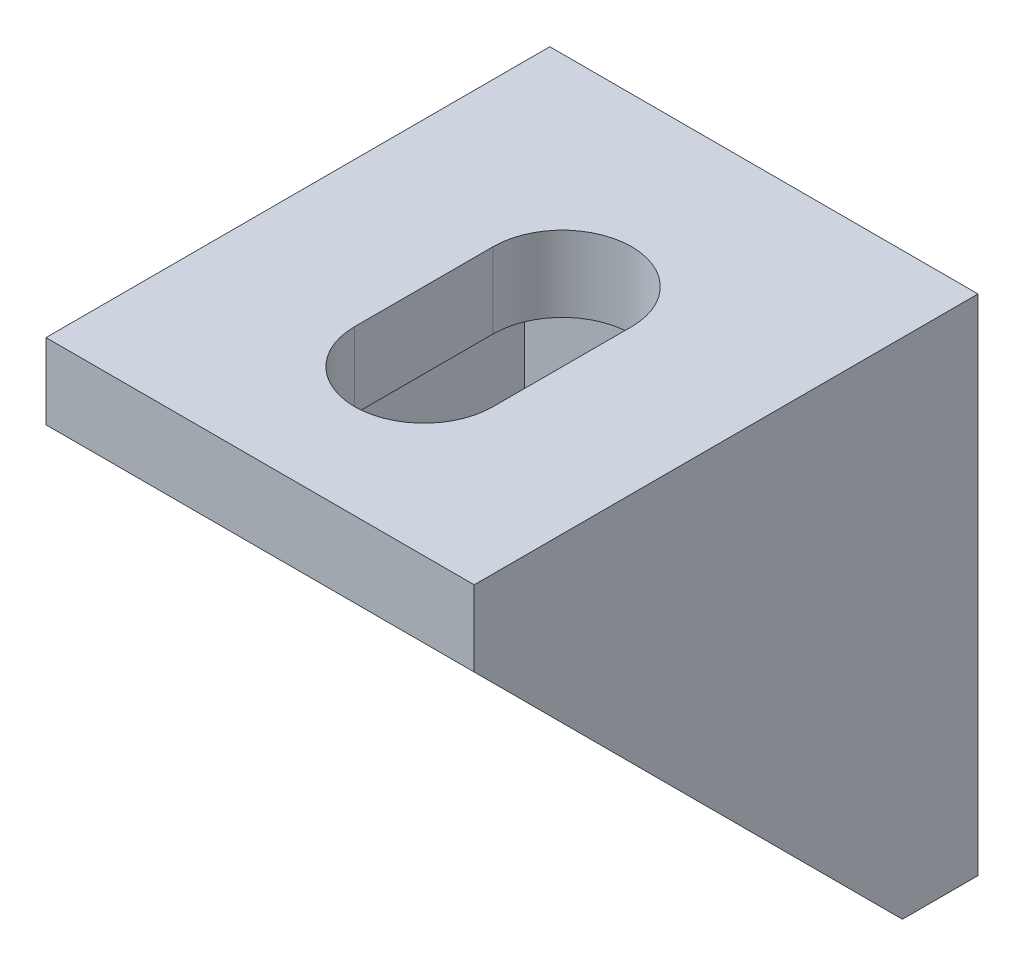
ISO-10303-21;
HEADER;
FILE_DESCRIPTION(('STEP AP214'),'2;1');
FILE_NAME('part.step','',(''),(''),'','','');
FILE_SCHEMA(('AUTOMOTIVE_DESIGN { 1 0 10303 214 1 1 1 1 }'));
ENDSEC;
DATA;
#1=APPLICATION_CONTEXT('core data for automotive mechanical design processes');
#2=APPLICATION_PROTOCOL_DEFINITION('international standard','automotive_design',2000,#1);
#3=PRODUCT_CONTEXT('',#1,'mechanical');
#4=PRODUCT('Part','Part','',(#3));
#5=PRODUCT_RELATED_PRODUCT_CATEGORY('part','',(#4));
#6=PRODUCT_DEFINITION_FORMATION('','',#4);
#7=PRODUCT_DEFINITION_CONTEXT('part definition',#1,'design');
#8=PRODUCT_DEFINITION('design','',#6,#7);
#9=PRODUCT_DEFINITION_SHAPE('','',#8);
#10=(LENGTH_UNIT() NAMED_UNIT(*) SI_UNIT(.MILLI.,.METRE.));
#11=(NAMED_UNIT(*) PLANE_ANGLE_UNIT() SI_UNIT($,.RADIAN.));
#12=(NAMED_UNIT(*) SI_UNIT($,.STERADIAN.) SOLID_ANGLE_UNIT());
#13=UNCERTAINTY_MEASURE_WITH_UNIT(LENGTH_MEASURE(1.E-05),#10,'distance_accuracy_value','');
#14=(GEOMETRIC_REPRESENTATION_CONTEXT(3) GLOBAL_UNCERTAINTY_ASSIGNED_CONTEXT((#13)) GLOBAL_UNIT_ASSIGNED_CONTEXT((#10,
#11,#12)) REPRESENTATION_CONTEXT('',''));
#15=CARTESIAN_POINT('',(0.,0.,0.));
#16=DIRECTION('',(0.,0.,1.));
#17=DIRECTION('',(1.,0.,0.));
#18=AXIS2_PLACEMENT_3D('',#15,#16,#17);
#19=CARTESIAN_POINT('',(8.5,-11.5,3.));
#20=DIRECTION('',(0.,0.,-1.));
#21=DIRECTION('',(0.,1.,0.));
#22=AXIS2_PLACEMENT_3D('',#19,#20,#21);
#23=PLANE('',#22);
#24=DIRECTION('',(0.,-1.,0.));
#25=VECTOR('',#24,1.);
#26=CARTESIAN_POINT('',(6.5,-11.5,3.));
#27=LINE('',#26,#25);
#28=CARTESIAN_POINT('',(6.5,-3.,3.));
#29=VERTEX_POINT('',#28);
#30=CARTESIAN_POINT('',(6.5,-20.,3.));
#31=VERTEX_POINT('',#30);
#32=EDGE_CURVE('E11',#29,#31,#27,.T.);
#33=ORIENTED_EDGE('',*,*,#32,.F.);
#34=DIRECTION('',(-1.,0.,0.));
#35=VECTOR('',#34,1.);
#36=CARTESIAN_POINT('',(8.5,-3.,3.));
#37=LINE('',#36,#35);
#38=CARTESIAN_POINT('',(-6.5,-3.,3.));
#39=VERTEX_POINT('',#38);
#40=EDGE_CURVE('E24',#29,#39,#37,.T.);
#41=ORIENTED_EDGE('',*,*,#40,.T.);
#42=DIRECTION('',(0.,1.,0.));
#43=VECTOR('',#42,1.);
#44=CARTESIAN_POINT('',(-6.5,-11.5,3.));
#45=LINE('',#44,#43);
#46=CARTESIAN_POINT('',(-6.5,-20.,3.));
#47=VERTEX_POINT('',#46);
#48=EDGE_CURVE('E232',#47,#39,#45,.T.);
#49=ORIENTED_EDGE('',*,*,#48,.F.);
#50=DIRECTION('',(-1.,0.,0.));
#51=VECTOR('',#50,1.);
#52=CARTESIAN_POINT('',(8.5,-20.,3.));
#53=LINE('',#52,#51);
#54=EDGE_CURVE('E230',#31,#47,#53,.T.);
#55=ORIENTED_EDGE('',*,*,#54,.F.);
#56=EDGE_LOOP('',(#33,#41,#49,#55));
#57=FACE_BOUND('',#56,.T.);
#58=CARTESIAN_POINT('',(0.,-13.5,3.));
#59=DIRECTION('',(0.,0.,-1.));
#60=DIRECTION('',(0.,1.,0.));
#61=AXIS2_PLACEMENT_3D('',#58,#59,#60);
#62=CIRCLE('',#61,2.75);
#63=CARTESIAN_POINT('',(-2.75,-13.5,3.));
#64=VERTEX_POINT('',#63);
#65=CARTESIAN_POINT('',(2.75,-13.5,3.));
#66=VERTEX_POINT('',#65);
#67=EDGE_CURVE('E227',#64,#66,#62,.F.);
#68=ORIENTED_EDGE('',*,*,#67,.F.);
#69=DIRECTION('',(0.,1.,0.));
#70=VECTOR('',#69,1.);
#71=CARTESIAN_POINT('',(-2.75,-11.5,3.));
#72=LINE('',#71,#70);
#73=CARTESIAN_POINT('',(-2.75,-8.,3.));
#74=VERTEX_POINT('',#73);
#75=EDGE_CURVE('E225',#64,#74,#72,.T.);
#76=ORIENTED_EDGE('',*,*,#75,.T.);
#77=CARTESIAN_POINT('',(0.,-8.,3.));
#78=DIRECTION('',(0.,0.,-1.));
#79=DIRECTION('',(0.,1.,0.));
#80=AXIS2_PLACEMENT_3D('',#77,#78,#79);
#81=CIRCLE('',#80,2.75);
#82=CARTESIAN_POINT('',(2.75,-8.,3.));
#83=VERTEX_POINT('',#82);
#84=EDGE_CURVE('E222',#83,#74,#81,.F.);
#85=ORIENTED_EDGE('',*,*,#84,.F.);
#86=DIRECTION('',(0.,1.,0.));
#87=VECTOR('',#86,1.);
#88=CARTESIAN_POINT('',(2.75,-11.5,3.));
#89=LINE('',#88,#87);
#90=EDGE_CURVE('E219',#66,#83,#89,.T.);
#91=ORIENTED_EDGE('',*,*,#90,.F.);
#92=EDGE_LOOP('',(#68,#76,#85,#91));
#93=FACE_BOUND('',#92,.T.);
#94=ADVANCED_FACE('F17',(#57,#93),#23,.F.);
#95=CARTESIAN_POINT('',(8.5,-10.,0.));
#96=DIRECTION('',(0.,0.,1.));
#97=DIRECTION('',(0.,-1.,0.));
#98=AXIS2_PLACEMENT_3D('',#95,#96,#97);
#99=PLANE('',#98);
#100=DIRECTION('',(0.,1.,0.));
#101=VECTOR('',#100,1.);
#102=CARTESIAN_POINT('',(-8.5,-10.,0.));
#103=LINE('',#102,#101);
#104=CARTESIAN_POINT('',(-8.5,-20.,0.));
#105=VERTEX_POINT('',#104);
#106=CARTESIAN_POINT('',(-8.5,0.,0.));
#107=VERTEX_POINT('',#106);
#108=EDGE_CURVE('E217',#105,#107,#103,.T.);
#109=ORIENTED_EDGE('',*,*,#108,.T.);
#110=DIRECTION('',(-1.,0.,0.));
#111=VECTOR('',#110,1.);
#112=CARTESIAN_POINT('',(8.5,0.,0.));
#113=LINE('',#112,#111);
#114=CARTESIAN_POINT('',(8.5,0.,0.));
#115=VERTEX_POINT('',#114);
#116=EDGE_CURVE('E214',#115,#107,#113,.T.);
#117=ORIENTED_EDGE('',*,*,#116,.F.);
#118=DIRECTION('',(0.,1.,0.));
#119=VECTOR('',#118,1.);
#120=CARTESIAN_POINT('',(8.5,-10.,0.));
#121=LINE('',#120,#119);
#122=CARTESIAN_POINT('',(8.5,-20.,0.));
#123=VERTEX_POINT('',#122);
#124=EDGE_CURVE('E212',#123,#115,#121,.T.);
#125=ORIENTED_EDGE('',*,*,#124,.F.);
#126=DIRECTION('',(-1.,0.,0.));
#127=VECTOR('',#126,1.);
#128=CARTESIAN_POINT('',(8.5,-20.,0.));
#129=LINE('',#128,#127);
#130=EDGE_CURVE('E210',#123,#105,#129,.T.);
#131=ORIENTED_EDGE('',*,*,#130,.T.);
#132=EDGE_LOOP('',(#109,#117,#125,#131));
#133=FACE_BOUND('',#132,.T.);
#134=CARTESIAN_POINT('',(0.,-13.5,0.));
#135=DIRECTION('',(0.,0.,1.));
#136=DIRECTION('',(1.,0.,0.));
#137=AXIS2_PLACEMENT_3D('',#134,#135,#136);
#138=CIRCLE('',#137,2.75);
#139=CARTESIAN_POINT('',(-2.75,-13.5,0.));
#140=VERTEX_POINT('',#139);
#141=CARTESIAN_POINT('',(2.75,-13.5,0.));
#142=VERTEX_POINT('',#141);
#143=EDGE_CURVE('E208',#140,#142,#138,.T.);
#144=ORIENTED_EDGE('',*,*,#143,.T.);
#145=DIRECTION('',(0.,1.,0.));
#146=VECTOR('',#145,1.);
#147=CARTESIAN_POINT('',(2.75,-10.75,0.));
#148=LINE('',#147,#146);
#149=CARTESIAN_POINT('',(2.75,-8.,0.));
#150=VERTEX_POINT('',#149);
#151=EDGE_CURVE('E206',#142,#150,#148,.T.);
#152=ORIENTED_EDGE('',*,*,#151,.T.);
#153=CARTESIAN_POINT('',(0.,-8.,0.));
#154=DIRECTION('',(0.,0.,1.));
#155=DIRECTION('',(1.,0.,0.));
#156=AXIS2_PLACEMENT_3D('',#153,#154,#155);
#157=CIRCLE('',#156,2.75);
#158=CARTESIAN_POINT('',(-2.75,-8.,0.));
#159=VERTEX_POINT('',#158);
#160=EDGE_CURVE('E204',#150,#159,#157,.T.);
#161=ORIENTED_EDGE('',*,*,#160,.T.);
#162=DIRECTION('',(0.,1.,0.));
#163=VECTOR('',#162,1.);
#164=CARTESIAN_POINT('',(-2.75,-10.75,0.));
#165=LINE('',#164,#163);
#166=EDGE_CURVE('E201',#140,#159,#165,.T.);
#167=ORIENTED_EDGE('',*,*,#166,.F.);
#168=EDGE_LOOP('',(#144,#152,#161,#167));
#169=FACE_BOUND('',#168,.T.);
#170=ADVANCED_FACE('F254',(#133,#169),#99,.F.);
#171=CARTESIAN_POINT('',(8.5,-3.,11.5));
#172=DIRECTION('',(0.,1.,0.));
#173=DIRECTION('',(0.,0.,1.));
#174=AXIS2_PLACEMENT_3D('',#171,#172,#173);
#175=PLANE('',#174);
#176=DIRECTION('',(0.,0.,-1.));
#177=VECTOR('',#176,1.);
#178=CARTESIAN_POINT('',(6.5,-3.,11.5));
#179=LINE('',#178,#177);
#180=CARTESIAN_POINT('',(6.5,-3.,20.));
#181=VERTEX_POINT('',#180);
#182=EDGE_CURVE('E198',#181,#29,#179,.T.);
#183=ORIENTED_EDGE('',*,*,#182,.F.);
#184=DIRECTION('',(-1.,0.,0.));
#185=VECTOR('',#184,1.);
#186=CARTESIAN_POINT('',(8.5,-3.,20.));
#187=LINE('',#186,#185);
#188=CARTESIAN_POINT('',(-6.5,-3.,20.));
#189=VERTEX_POINT('',#188);
#190=EDGE_CURVE('E132',#181,#189,#187,.T.);
#191=ORIENTED_EDGE('',*,*,#190,.T.);
#192=DIRECTION('',(0.,0.,1.));
#193=VECTOR('',#192,1.);
#194=CARTESIAN_POINT('',(-6.5,-3.,11.5));
#195=LINE('',#194,#193);
#196=EDGE_CURVE('E195',#39,#189,#195,.T.);
#197=ORIENTED_EDGE('',*,*,#196,.F.);
#198=ORIENTED_EDGE('',*,*,#40,.F.);
#199=EDGE_LOOP('',(#183,#191,#197,#198));
#200=FACE_BOUND('',#199,.T.);
#201=DIRECTION('',(0.,0.,-1.));
#202=VECTOR('',#201,1.);
#203=CARTESIAN_POINT('',(-2.75,-3.,11.5));
#204=LINE('',#203,#202);
#205=CARTESIAN_POINT('',(-2.75,-3.,13.5));
#206=VERTEX_POINT('',#205);
#207=CARTESIAN_POINT('',(-2.75,-3.,8.));
#208=VERTEX_POINT('',#207);
#209=EDGE_CURVE('E192',#206,#208,#204,.T.);
#210=ORIENTED_EDGE('',*,*,#209,.F.);
#211=CARTESIAN_POINT('',(0.,-3.,13.5));
#212=DIRECTION('',(0.,1.,0.));
#213=DIRECTION('',(0.,0.,1.));
#214=AXIS2_PLACEMENT_3D('',#211,#212,#213);
#215=CIRCLE('',#214,2.75);
#216=CARTESIAN_POINT('',(2.75,-3.,13.5));
#217=VERTEX_POINT('',#216);
#218=EDGE_CURVE('E190',#206,#217,#215,.T.);
#219=ORIENTED_EDGE('',*,*,#218,.T.);
#220=DIRECTION('',(0.,0.,1.));
#221=VECTOR('',#220,1.);
#222=CARTESIAN_POINT('',(2.75,-3.,11.5));
#223=LINE('',#222,#221);
#224=CARTESIAN_POINT('',(2.75,-3.,8.));
#225=VERTEX_POINT('',#224);
#226=EDGE_CURVE('E187',#225,#217,#223,.T.);
#227=ORIENTED_EDGE('',*,*,#226,.F.);
#228=CARTESIAN_POINT('',(0.,-3.,8.));
#229=DIRECTION('',(0.,1.,0.));
#230=DIRECTION('',(0.,0.,1.));
#231=AXIS2_PLACEMENT_3D('',#228,#229,#230);
#232=CIRCLE('',#231,2.75);
#233=EDGE_CURVE('E185',#225,#208,#232,.T.);
#234=ORIENTED_EDGE('',*,*,#233,.T.);
#235=EDGE_LOOP('',(#210,#219,#227,#234));
#236=FACE_BOUND('',#235,.T.);
#237=ADVANCED_FACE('F260',(#200,#236),#175,.F.);
#238=CARTESIAN_POINT('',(8.5,0.,10.));
#239=DIRECTION('',(0.,-1.,0.));
#240=DIRECTION('',(0.,0.,-1.));
#241=AXIS2_PLACEMENT_3D('',#238,#239,#240);
#242=PLANE('',#241);
#243=DIRECTION('',(0.,0.,1.));
#244=VECTOR('',#243,1.);
#245=CARTESIAN_POINT('',(-8.5,0.,10.));
#246=LINE('',#245,#244);
#247=CARTESIAN_POINT('',(-8.5,0.,20.));
#248=VERTEX_POINT('',#247);
#249=EDGE_CURVE('E183',#107,#248,#246,.T.);
#250=ORIENTED_EDGE('',*,*,#249,.T.);
#251=DIRECTION('',(-1.,0.,0.));
#252=VECTOR('',#251,1.);
#253=CARTESIAN_POINT('',(8.5,0.,20.));
#254=LINE('',#253,#252);
#255=CARTESIAN_POINT('',(8.5,0.,20.));
#256=VERTEX_POINT('',#255);
#257=EDGE_CURVE('E181',#256,#248,#254,.T.);
#258=ORIENTED_EDGE('',*,*,#257,.F.);
#259=DIRECTION('',(0.,0.,1.));
#260=VECTOR('',#259,1.);
#261=CARTESIAN_POINT('',(8.5,0.,10.));
#262=LINE('',#261,#260);
#263=EDGE_CURVE('E147',#115,#256,#262,.T.);
#264=ORIENTED_EDGE('',*,*,#263,.F.);
#265=ORIENTED_EDGE('',*,*,#116,.T.);
#266=EDGE_LOOP('',(#250,#258,#264,#265));
#267=FACE_BOUND('',#266,.T.);
#268=DIRECTION('',(0.,0.,-1.));
#269=VECTOR('',#268,1.);
#270=CARTESIAN_POINT('',(-2.75,0.,10.75));
#271=LINE('',#270,#269);
#272=CARTESIAN_POINT('',(-2.75,0.,13.5));
#273=VERTEX_POINT('',#272);
#274=CARTESIAN_POINT('',(-2.75,0.,8.));
#275=VERTEX_POINT('',#274);
#276=EDGE_CURVE('E178',#273,#275,#271,.T.);
#277=ORIENTED_EDGE('',*,*,#276,.T.);
#278=CARTESIAN_POINT('',(0.,0.,8.));
#279=DIRECTION('',(0.,1.,0.));
#280=DIRECTION('',(0.,0.,1.));
#281=AXIS2_PLACEMENT_3D('',#278,#279,#280);
#282=CIRCLE('',#281,2.75);
#283=CARTESIAN_POINT('',(2.75,0.,8.));
#284=VERTEX_POINT('',#283);
#285=EDGE_CURVE('E175',#284,#275,#282,.T.);
#286=ORIENTED_EDGE('',*,*,#285,.F.);
#287=DIRECTION('',(0.,0.,1.));
#288=VECTOR('',#287,1.);
#289=CARTESIAN_POINT('',(2.75,0.,10.75));
#290=LINE('',#289,#288);
#291=CARTESIAN_POINT('',(2.75,0.,13.5));
#292=VERTEX_POINT('',#291);
#293=EDGE_CURVE('E173',#284,#292,#290,.T.);
#294=ORIENTED_EDGE('',*,*,#293,.T.);
#295=CARTESIAN_POINT('',(0.,0.,13.5));
#296=DIRECTION('',(0.,1.,0.));
#297=DIRECTION('',(0.,0.,1.));
#298=AXIS2_PLACEMENT_3D('',#295,#296,#297);
#299=CIRCLE('',#298,2.75);
#300=EDGE_CURVE('E170',#273,#292,#299,.T.);
#301=ORIENTED_EDGE('',*,*,#300,.F.);
#302=EDGE_LOOP('',(#277,#286,#294,#301));
#303=FACE_BOUND('',#302,.T.);
#304=ADVANCED_FACE('F257',(#267,#303),#242,.F.);
#305=CARTESIAN_POINT('',(8.5,-20.,1.5));
#306=DIRECTION('',(0.,1.,0.));
#307=DIRECTION('',(0.,0.,1.));
#308=AXIS2_PLACEMENT_3D('',#305,#306,#307);
#309=PLANE('',#308);
#310=DIRECTION('',(0.,0.,-1.));
#311=VECTOR('',#310,1.);
#312=CARTESIAN_POINT('',(-8.5,-20.,1.5));
#313=LINE('',#312,#311);
#314=CARTESIAN_POINT('',(-8.5,-20.,3.));
#315=VERTEX_POINT('',#314);
#316=EDGE_CURVE('E167',#315,#105,#313,.T.);
#317=ORIENTED_EDGE('',*,*,#316,.T.);
#318=ORIENTED_EDGE('',*,*,#130,.F.);
#319=DIRECTION('',(0.,0.,-1.));
#320=VECTOR('',#319,1.);
#321=CARTESIAN_POINT('',(8.5,-20.,1.5));
#322=LINE('',#321,#320);
#323=CARTESIAN_POINT('',(8.5,-20.,3.));
#324=VERTEX_POINT('',#323);
#325=EDGE_CURVE('E165',#324,#123,#322,.T.);
#326=ORIENTED_EDGE('',*,*,#325,.F.);
#327=EDGE_CURVE('E151',#324,#31,#53,.T.);
#328=ORIENTED_EDGE('',*,*,#327,.T.);
#329=ORIENTED_EDGE('',*,*,#54,.T.);
#330=DIRECTION('',(1.,0.,0.));
#331=VECTOR('',#330,1.);
#332=CARTESIAN_POINT('',(-8.502,-20.,3.));
#333=LINE('',#332,#331);
#334=EDGE_CURVE('E162',#315,#47,#333,.T.);
#335=ORIENTED_EDGE('',*,*,#334,.F.);
#336=EDGE_LOOP('',(#317,#318,#326,#328,#329,#335));
#337=FACE_BOUND('',#336,.T.);
#338=ADVANCED_FACE('F238',(#337),#309,.F.);
#339=CARTESIAN_POINT('',(8.5,-1.5,20.));
#340=DIRECTION('',(0.,0.,-1.));
#341=DIRECTION('',(0.,1.,0.));
#342=AXIS2_PLACEMENT_3D('',#339,#340,#341);
#343=PLANE('',#342);
#344=DIRECTION('',(0.,-1.,0.));
#345=VECTOR('',#344,1.);
#346=CARTESIAN_POINT('',(-8.5,-1.5,20.));
#347=LINE('',#346,#345);
#348=CARTESIAN_POINT('',(-8.5,-3.,20.));
#349=VERTEX_POINT('',#348);
#350=EDGE_CURVE('E160',#248,#349,#347,.T.);
#351=ORIENTED_EDGE('',*,*,#350,.T.);
#352=DIRECTION('',(1.,0.,0.));
#353=VECTOR('',#352,1.);
#354=CARTESIAN_POINT('',(-8.502,-3.,20.));
#355=LINE('',#354,#353);
#356=EDGE_CURVE('E137',#349,#189,#355,.T.);
#357=ORIENTED_EDGE('',*,*,#356,.T.);
#358=ORIENTED_EDGE('',*,*,#190,.F.);
#359=CARTESIAN_POINT('',(8.5,-3.,20.));
#360=VERTEX_POINT('',#359);
#361=EDGE_CURVE('E125',#360,#181,#187,.T.);
#362=ORIENTED_EDGE('',*,*,#361,.F.);
#363=DIRECTION('',(0.,-1.,0.));
#364=VECTOR('',#363,1.);
#365=CARTESIAN_POINT('',(8.5,-1.5,20.));
#366=LINE('',#365,#364);
#367=EDGE_CURVE('E129',#256,#360,#366,.T.);
#368=ORIENTED_EDGE('',*,*,#367,.F.);
#369=ORIENTED_EDGE('',*,*,#257,.T.);
#370=EDGE_LOOP('',(#351,#357,#358,#362,#368,#369));
#371=FACE_BOUND('',#370,.T.);
#372=ADVANCED_FACE('F127',(#371),#343,.F.);
#373=CARTESIAN_POINT('',(8.5,-10.,10.));
#374=DIRECTION('',(1.,0.,0.));
#375=DIRECTION('',(0.,1.,0.));
#376=AXIS2_PLACEMENT_3D('',#373,#374,#375);
#377=PLANE('',#376);
#378=DIRECTION('',(0.,0.707106781186548,0.707106781186548));
#379=VECTOR('',#378,1.);
#380=CARTESIAN_POINT('',(8.5,-11.5,11.5));
#381=LINE('',#380,#379);
#382=EDGE_CURVE('E143',#324,#360,#381,.T.);
#383=ORIENTED_EDGE('',*,*,#382,.F.);
#384=ORIENTED_EDGE('',*,*,#325,.T.);
#385=ORIENTED_EDGE('',*,*,#124,.T.);
#386=ORIENTED_EDGE('',*,*,#263,.T.);
#387=ORIENTED_EDGE('',*,*,#367,.T.);
#388=EDGE_LOOP('',(#383,#384,#385,#386,#387));
#389=FACE_BOUND('',#388,.T.);
#390=ADVANCED_FACE('F141',(#389),#377,.T.);
#391=CARTESIAN_POINT('',(-8.5,-10.,10.));
#392=DIRECTION('',(1.,0.,0.));
#393=DIRECTION('',(0.,1.,0.));
#394=AXIS2_PLACEMENT_3D('',#391,#392,#393);
#395=PLANE('',#394);
#396=ORIENTED_EDGE('',*,*,#316,.F.);
#397=DIRECTION('',(0.,-0.707106781186548,-0.707106781186548));
#398=VECTOR('',#397,1.);
#399=CARTESIAN_POINT('',(-8.5,-11.5,11.5));
#400=LINE('',#399,#398);
#401=EDGE_CURVE('E152',#349,#315,#400,.T.);
#402=ORIENTED_EDGE('',*,*,#401,.F.);
#403=ORIENTED_EDGE('',*,*,#350,.F.);
#404=ORIENTED_EDGE('',*,*,#249,.F.);
#405=ORIENTED_EDGE('',*,*,#108,.F.);
#406=EDGE_LOOP('',(#396,#402,#403,#404,#405));
#407=FACE_BOUND('',#406,.T.);
#408=ADVANCED_FACE('F249',(#407),#395,.F.);
#409=CARTESIAN_POINT('',(-6.5,-10.,10.));
#410=DIRECTION('',(1.,0.,0.));
#411=DIRECTION('',(0.,1.,0.));
#412=AXIS2_PLACEMENT_3D('',#409,#410,#411);
#413=PLANE('',#412);
#414=ORIENTED_EDGE('',*,*,#196,.T.);
#415=DIRECTION('',(0.,-0.707106781186548,-0.707106781186548));
#416=VECTOR('',#415,1.);
#417=CARTESIAN_POINT('',(-6.5,-11.5,11.5));
#418=LINE('',#417,#416);
#419=EDGE_CURVE('E155',#189,#47,#418,.T.);
#420=ORIENTED_EDGE('',*,*,#419,.T.);
#421=ORIENTED_EDGE('',*,*,#48,.T.);
#422=EDGE_LOOP('',(#414,#420,#421));
#423=FACE_BOUND('',#422,.T.);
#424=ADVANCED_FACE('F241',(#423),#413,.T.);
#425=CARTESIAN_POINT('',(-8.502,-11.5,11.5));
#426=DIRECTION('',(0.,0.707106781186548,-0.707106781186547));
#427=DIRECTION('',(0.,0.707106781186548,0.707106781186548));
#428=AXIS2_PLACEMENT_3D('',#425,#426,#427);
#429=PLANE('',#428);
#430=ORIENTED_EDGE('',*,*,#419,.F.);
#431=ORIENTED_EDGE('',*,*,#356,.F.);
#432=ORIENTED_EDGE('',*,*,#401,.T.);
#433=ORIENTED_EDGE('',*,*,#334,.T.);
#434=EDGE_LOOP('',(#430,#431,#432,#433));
#435=FACE_BOUND('',#434,.T.);
#436=ADVANCED_FACE('F245',(#435),#429,.F.);
#437=CARTESIAN_POINT('',(6.5,-10.,10.));
#438=DIRECTION('',(1.,0.,0.));
#439=DIRECTION('',(0.,1.,0.));
#440=AXIS2_PLACEMENT_3D('',#437,#438,#439);
#441=PLANE('',#440);
#442=ORIENTED_EDGE('',*,*,#32,.T.);
#443=DIRECTION('',(0.,0.707106781186548,0.707106781186548));
#444=VECTOR('',#443,1.);
#445=CARTESIAN_POINT('',(6.5,-11.5,11.5));
#446=LINE('',#445,#444);
#447=EDGE_CURVE('E244',#31,#181,#446,.T.);
#448=ORIENTED_EDGE('',*,*,#447,.T.);
#449=ORIENTED_EDGE('',*,*,#182,.T.);
#450=EDGE_LOOP('',(#442,#448,#449));
#451=FACE_BOUND('',#450,.T.);
#452=ADVANCED_FACE('F292',(#451),#441,.F.);
#453=CARTESIAN_POINT('',(8.502,-11.5,11.5));
#454=DIRECTION('',(0.,-0.707106781186548,0.707106781186547));
#455=DIRECTION('',(0.,-0.707106781186548,-0.707106781186548));
#456=AXIS2_PLACEMENT_3D('',#453,#454,#455);
#457=PLANE('',#456);
#458=ORIENTED_EDGE('',*,*,#447,.F.);
#459=ORIENTED_EDGE('',*,*,#327,.F.);
#460=ORIENTED_EDGE('',*,*,#382,.T.);
#461=ORIENTED_EDGE('',*,*,#361,.T.);
#462=EDGE_LOOP('',(#458,#459,#460,#461));
#463=FACE_BOUND('',#462,.T.);
#464=ADVANCED_FACE('F149',(#463),#457,.T.);
#465=CARTESIAN_POINT('',(-2.75,-33.01,10.75));
#466=DIRECTION('',(1.,0.,0.));
#467=DIRECTION('',(0.,0.,-1.));
#468=AXIS2_PLACEMENT_3D('',#465,#466,#467);
#469=PLANE('',#468);
#470=ORIENTED_EDGE('',*,*,#209,.T.);
#471=DIRECTION('',(0.,1.,0.));
#472=VECTOR('',#471,1.);
#473=CARTESIAN_POINT('',(-2.75,-33.01,8.));
#474=LINE('',#473,#472);
#475=EDGE_CURVE('E269',#208,#275,#474,.T.);
#476=ORIENTED_EDGE('',*,*,#475,.T.);
#477=ORIENTED_EDGE('',*,*,#276,.F.);
#478=DIRECTION('',(0.,1.,0.));
#479=VECTOR('',#478,1.);
#480=CARTESIAN_POINT('',(-2.75,-33.01,13.5));
#481=LINE('',#480,#479);
#482=EDGE_CURVE('E273',#206,#273,#481,.T.);
#483=ORIENTED_EDGE('',*,*,#482,.F.);
#484=EDGE_LOOP('',(#470,#476,#477,#483));
#485=FACE_BOUND('',#484,.T.);
#486=ADVANCED_FACE('F270',(#485),#469,.T.);
#487=CARTESIAN_POINT('',(0.,-33.01,13.5));
#488=DIRECTION('',(0.,1.,0.));
#489=DIRECTION('',(0.,0.,1.));
#490=AXIS2_PLACEMENT_3D('',#487,#488,#489);
#491=CYLINDRICAL_SURFACE('',#490,2.75);
#492=ORIENTED_EDGE('',*,*,#482,.T.);
#493=ORIENTED_EDGE('',*,*,#300,.T.);
#494=DIRECTION('',(0.,1.,0.));
#495=VECTOR('',#494,1.);
#496=CARTESIAN_POINT('',(2.75,-33.01,13.5));
#497=LINE('',#496,#495);
#498=EDGE_CURVE('E280',#217,#292,#497,.T.);
#499=ORIENTED_EDGE('',*,*,#498,.F.);
#500=ORIENTED_EDGE('',*,*,#218,.F.);
#501=EDGE_LOOP('',(#492,#493,#499,#500));
#502=FACE_BOUND('',#501,.T.);
#503=ADVANCED_FACE('F300',(#502),#491,.F.);
#504=CARTESIAN_POINT('',(2.75,-33.01,10.75));
#505=DIRECTION('',(-1.,0.,0.));
#506=DIRECTION('',(0.,0.,1.));
#507=AXIS2_PLACEMENT_3D('',#504,#505,#506);
#508=PLANE('',#507);
#509=ORIENTED_EDGE('',*,*,#226,.T.);
#510=ORIENTED_EDGE('',*,*,#498,.T.);
#511=ORIENTED_EDGE('',*,*,#293,.F.);
#512=DIRECTION('',(0.,1.,0.));
#513=VECTOR('',#512,1.);
#514=CARTESIAN_POINT('',(2.75,-33.01,8.));
#515=LINE('',#514,#513);
#516=EDGE_CURVE('E278',#225,#284,#515,.T.);
#517=ORIENTED_EDGE('',*,*,#516,.F.);
#518=EDGE_LOOP('',(#509,#510,#511,#517));
#519=FACE_BOUND('',#518,.T.);
#520=ADVANCED_FACE('F301',(#519),#508,.T.);
#521=CARTESIAN_POINT('',(0.,-33.01,8.));
#522=DIRECTION('',(0.,1.,0.));
#523=DIRECTION('',(0.,0.,1.));
#524=AXIS2_PLACEMENT_3D('',#521,#522,#523);
#525=CYLINDRICAL_SURFACE('',#524,2.75);
#526=ORIENTED_EDGE('',*,*,#516,.T.);
#527=ORIENTED_EDGE('',*,*,#285,.T.);
#528=ORIENTED_EDGE('',*,*,#475,.F.);
#529=ORIENTED_EDGE('',*,*,#233,.F.);
#530=EDGE_LOOP('',(#526,#527,#528,#529));
#531=FACE_BOUND('',#530,.T.);
#532=ADVANCED_FACE('F276',(#531),#525,.F.);
#533=CARTESIAN_POINT('',(0.,-13.5,33.01));
#534=DIRECTION('',(0.,0.,-1.));
#535=DIRECTION('',(-1.,0.,0.));
#536=AXIS2_PLACEMENT_3D('',#533,#534,#535);
#537=CYLINDRICAL_SURFACE('',#536,2.75);
#538=ORIENTED_EDGE('',*,*,#67,.T.);
#539=DIRECTION('',(0.,0.,-1.));
#540=VECTOR('',#539,1.);
#541=CARTESIAN_POINT('',(2.75,-13.5,33.01));
#542=LINE('',#541,#540);
#543=EDGE_CURVE('E281',#66,#142,#542,.T.);
#544=ORIENTED_EDGE('',*,*,#543,.T.);
#545=ORIENTED_EDGE('',*,*,#143,.F.);
#546=DIRECTION('',(0.,0.,-1.));
#547=VECTOR('',#546,1.);
#548=CARTESIAN_POINT('',(-2.75,-13.5,33.01));
#549=LINE('',#548,#547);
#550=EDGE_CURVE('E286',#64,#140,#549,.T.);
#551=ORIENTED_EDGE('',*,*,#550,.F.);
#552=EDGE_LOOP('',(#538,#544,#545,#551));
#553=FACE_BOUND('',#552,.T.);
#554=ADVANCED_FACE('F309',(#553),#537,.F.);
#555=CARTESIAN_POINT('',(2.75,-10.75,33.01));
#556=DIRECTION('',(-1.,0.,0.));
#557=DIRECTION('',(0.,0.,1.));
#558=AXIS2_PLACEMENT_3D('',#555,#556,#557);
#559=PLANE('',#558);
#560=ORIENTED_EDGE('',*,*,#90,.T.);
#561=DIRECTION('',(0.,0.,-1.));
#562=VECTOR('',#561,1.);
#563=CARTESIAN_POINT('',(2.75,-8.,33.01));
#564=LINE('',#563,#562);
#565=EDGE_CURVE('E324',#83,#150,#564,.T.);
#566=ORIENTED_EDGE('',*,*,#565,.T.);
#567=ORIENTED_EDGE('',*,*,#151,.F.);
#568=ORIENTED_EDGE('',*,*,#543,.F.);
#569=EDGE_LOOP('',(#560,#566,#567,#568));
#570=FACE_BOUND('',#569,.T.);
#571=ADVANCED_FACE('F337',(#570),#559,.T.);
#572=CARTESIAN_POINT('',(0.,-8.,33.01));
#573=DIRECTION('',(0.,0.,-1.));
#574=DIRECTION('',(-1.,0.,0.));
#575=AXIS2_PLACEMENT_3D('',#572,#573,#574);
#576=CYLINDRICAL_SURFACE('',#575,2.75);
#577=ORIENTED_EDGE('',*,*,#84,.T.);
#578=DIRECTION('',(0.,0.,-1.));
#579=VECTOR('',#578,1.);
#580=CARTESIAN_POINT('',(-2.75,-8.,33.01));
#581=LINE('',#580,#579);
#582=EDGE_CURVE('E328',#74,#159,#581,.T.);
#583=ORIENTED_EDGE('',*,*,#582,.T.);
#584=ORIENTED_EDGE('',*,*,#160,.F.);
#585=ORIENTED_EDGE('',*,*,#565,.F.);
#586=EDGE_LOOP('',(#577,#583,#584,#585));
#587=FACE_BOUND('',#586,.T.);
#588=ADVANCED_FACE('F338',(#587),#576,.F.);
#589=CARTESIAN_POINT('',(-2.75,-10.75,33.01));
#590=DIRECTION('',(-1.,0.,0.));
#591=DIRECTION('',(0.,0.,1.));
#592=AXIS2_PLACEMENT_3D('',#589,#590,#591);
#593=PLANE('',#592);
#594=ORIENTED_EDGE('',*,*,#550,.T.);
#595=ORIENTED_EDGE('',*,*,#166,.T.);
#596=ORIENTED_EDGE('',*,*,#582,.F.);
#597=ORIENTED_EDGE('',*,*,#75,.F.);
#598=EDGE_LOOP('',(#594,#595,#596,#597));
#599=FACE_BOUND('',#598,.T.);
#600=ADVANCED_FACE('F326',(#599),#593,.F.);
#601=CLOSED_SHELL('',(#94,#170,#237,#304,#338,#372,#390,#408,#424,#436,#452,#464,#486,#503,#520,
#532,#554,#571,#588,#600));
#602=MANIFOLD_SOLID_BREP('B1',#601);
#603=ADVANCED_BREP_SHAPE_REPRESENTATION('',(#18,#602),#14);
#604=SHAPE_DEFINITION_REPRESENTATION(#9,#603);
ENDSEC;
END-ISO-10303-21;
